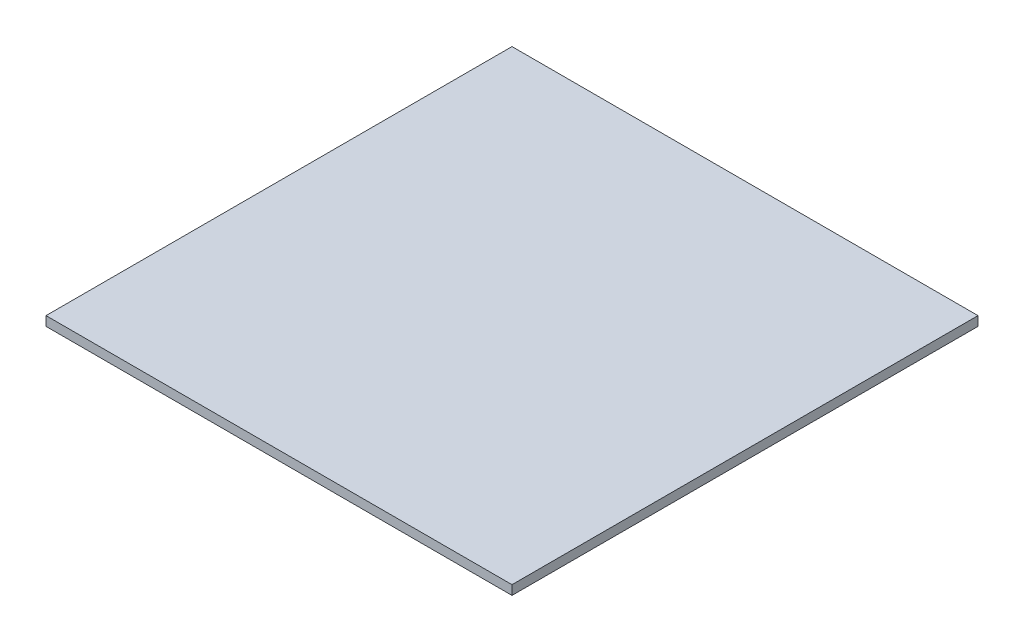
ISO-10303-21;
HEADER;
FILE_DESCRIPTION(('STEP AP214'),'2;1');
FILE_NAME('part.step','',(''),(''),'','','');
FILE_SCHEMA(('AUTOMOTIVE_DESIGN { 1 0 10303 214 1 1 1 1 }'));
ENDSEC;
DATA;
#1=APPLICATION_CONTEXT('core data for automotive mechanical design processes');
#2=APPLICATION_PROTOCOL_DEFINITION('international standard','automotive_design',2000,#1);
#3=PRODUCT_CONTEXT('',#1,'mechanical');
#4=PRODUCT('Part','Part','',(#3));
#5=PRODUCT_RELATED_PRODUCT_CATEGORY('part','',(#4));
#6=PRODUCT_DEFINITION_FORMATION('','',#4);
#7=PRODUCT_DEFINITION_CONTEXT('part definition',#1,'design');
#8=PRODUCT_DEFINITION('design','',#6,#7);
#9=PRODUCT_DEFINITION_SHAPE('','',#8);
#10=(LENGTH_UNIT() NAMED_UNIT(*) SI_UNIT(.MILLI.,.METRE.));
#11=(NAMED_UNIT(*) PLANE_ANGLE_UNIT() SI_UNIT($,.RADIAN.));
#12=(NAMED_UNIT(*) SI_UNIT($,.STERADIAN.) SOLID_ANGLE_UNIT());
#13=UNCERTAINTY_MEASURE_WITH_UNIT(LENGTH_MEASURE(1.E-05),#10,'distance_accuracy_value','');
#14=(GEOMETRIC_REPRESENTATION_CONTEXT(3) GLOBAL_UNCERTAINTY_ASSIGNED_CONTEXT((#13)) GLOBAL_UNIT_ASSIGNED_CONTEXT((#10,
#11,#12)) REPRESENTATION_CONTEXT('',''));
#15=CARTESIAN_POINT('',(0.,0.,0.));
#16=DIRECTION('',(0.,0.,1.));
#17=DIRECTION('',(1.,0.,0.));
#18=AXIS2_PLACEMENT_3D('',#15,#16,#17);
#19=CARTESIAN_POINT('',(237.6999945,-9.525,-237.6999945));
#20=DIRECTION('',(1.,0.,0.));
#21=DIRECTION('',(0.,0.,-1.));
#22=AXIS2_PLACEMENT_3D('',#19,#20,#21);
#23=PLANE('',#22);
#24=DIRECTION('',(0.,1.,0.));
#25=VECTOR('',#24,1.);
#26=CARTESIAN_POINT('',(237.6999945,-9.525,237.6999945));
#27=LINE('',#26,#25);
#28=CARTESIAN_POINT('',(237.6999945,-9.525,237.6999945));
#29=VERTEX_POINT('',#28);
#30=CARTESIAN_POINT('',(237.6999945,0.,237.6999945));
#31=VERTEX_POINT('',#30);
#32=EDGE_CURVE('E96',#29,#31,#27,.T.);
#33=ORIENTED_EDGE('',*,*,#32,.F.);
#34=DIRECTION('',(0.,0.,1.));
#35=VECTOR('',#34,1.);
#36=CARTESIAN_POINT('',(237.6999945,-9.525,-237.6999945));
#37=LINE('',#36,#35);
#38=CARTESIAN_POINT('',(237.6999945,-9.525,-237.6999945));
#39=VERTEX_POINT('',#38);
#40=EDGE_CURVE('E11',#39,#29,#37,.T.);
#41=ORIENTED_EDGE('',*,*,#40,.F.);
#42=DIRECTION('',(0.,1.,0.));
#43=VECTOR('',#42,1.);
#44=CARTESIAN_POINT('',(237.6999945,-9.525,-237.6999945));
#45=LINE('',#44,#43);
#46=CARTESIAN_POINT('',(237.6999945,0.,-237.6999945));
#47=VERTEX_POINT('',#46);
#48=EDGE_CURVE('E90',#39,#47,#45,.T.);
#49=ORIENTED_EDGE('',*,*,#48,.T.);
#50=DIRECTION('',(0.,0.,1.));
#51=VECTOR('',#50,1.);
#52=CARTESIAN_POINT('',(237.6999945,0.,-237.6999945));
#53=LINE('',#52,#51);
#54=EDGE_CURVE('E35',#47,#31,#53,.T.);
#55=ORIENTED_EDGE('',*,*,#54,.T.);
#56=EDGE_LOOP('',(#33,#41,#49,#55));
#57=FACE_BOUND('',#56,.T.);
#58=ADVANCED_FACE('F32',(#57),#23,.T.);
#59=CARTESIAN_POINT('',(-237.6999945,-9.525,-237.6999945));
#60=DIRECTION('',(0.,-1.,0.));
#61=DIRECTION('',(0.,0.,-1.));
#62=AXIS2_PLACEMENT_3D('',#59,#60,#61);
#63=PLANE('',#62);
#64=DIRECTION('',(1.,0.,0.));
#65=VECTOR('',#64,1.);
#66=CARTESIAN_POINT('',(-237.6999945,-9.525,237.6999945));
#67=LINE('',#66,#65);
#68=CARTESIAN_POINT('',(-237.6999945,-9.525,237.6999945));
#69=VERTEX_POINT('',#68);
#70=EDGE_CURVE('E92',#69,#29,#67,.T.);
#71=ORIENTED_EDGE('',*,*,#70,.F.);
#72=DIRECTION('',(0.,0.,1.));
#73=VECTOR('',#72,1.);
#74=CARTESIAN_POINT('',(-237.6999945,-9.525,-237.6999945));
#75=LINE('',#74,#73);
#76=CARTESIAN_POINT('',(-237.6999945,-9.525,-237.6999945));
#77=VERTEX_POINT('',#76);
#78=EDGE_CURVE('E41',#77,#69,#75,.T.);
#79=ORIENTED_EDGE('',*,*,#78,.F.);
#80=DIRECTION('',(1.,0.,0.));
#81=VECTOR('',#80,1.);
#82=CARTESIAN_POINT('',(-237.6999945,-9.525,-237.6999945));
#83=LINE('',#82,#81);
#84=EDGE_CURVE('E87',#77,#39,#83,.T.);
#85=ORIENTED_EDGE('',*,*,#84,.T.);
#86=ORIENTED_EDGE('',*,*,#40,.T.);
#87=EDGE_LOOP('',(#71,#79,#85,#86));
#88=FACE_BOUND('',#87,.T.);
#89=ADVANCED_FACE('F106',(#88),#63,.T.);
#90=CARTESIAN_POINT('',(-237.6999945,-9.525,-237.6999945));
#91=DIRECTION('',(-1.,0.,0.));
#92=DIRECTION('',(0.,0.,1.));
#93=AXIS2_PLACEMENT_3D('',#90,#91,#92);
#94=PLANE('',#93);
#95=DIRECTION('',(0.,-1.,0.));
#96=VECTOR('',#95,1.);
#97=CARTESIAN_POINT('',(-237.6999945,-9.525,237.6999945));
#98=LINE('',#97,#96);
#99=CARTESIAN_POINT('',(-237.6999945,0.,237.6999945));
#100=VERTEX_POINT('',#99);
#101=EDGE_CURVE('E82',#100,#69,#98,.T.);
#102=ORIENTED_EDGE('',*,*,#101,.F.);
#103=DIRECTION('',(0.,0.,1.));
#104=VECTOR('',#103,1.);
#105=CARTESIAN_POINT('',(-237.6999945,0.,-237.6999945));
#106=LINE('',#105,#104);
#107=CARTESIAN_POINT('',(-237.6999945,0.,-237.6999945));
#108=VERTEX_POINT('',#107);
#109=EDGE_CURVE('E77',#108,#100,#106,.T.);
#110=ORIENTED_EDGE('',*,*,#109,.F.);
#111=DIRECTION('',(0.,-1.,0.));
#112=VECTOR('',#111,1.);
#113=CARTESIAN_POINT('',(-237.6999945,-9.525,-237.6999945));
#114=LINE('',#113,#112);
#115=EDGE_CURVE('E80',#108,#77,#114,.T.);
#116=ORIENTED_EDGE('',*,*,#115,.T.);
#117=ORIENTED_EDGE('',*,*,#78,.T.);
#118=EDGE_LOOP('',(#102,#110,#116,#117));
#119=FACE_BOUND('',#118,.T.);
#120=ADVANCED_FACE('F79',(#119),#94,.T.);
#121=CARTESIAN_POINT('',(-237.6999945,0.,-237.6999945));
#122=DIRECTION('',(0.,1.,0.));
#123=DIRECTION('',(0.,0.,1.));
#124=AXIS2_PLACEMENT_3D('',#121,#122,#123);
#125=PLANE('',#124);
#126=DIRECTION('',(-1.,0.,0.));
#127=VECTOR('',#126,1.);
#128=CARTESIAN_POINT('',(-237.6999945,0.,237.6999945));
#129=LINE('',#128,#127);
#130=EDGE_CURVE('E99',#31,#100,#129,.T.);
#131=ORIENTED_EDGE('',*,*,#130,.F.);
#132=ORIENTED_EDGE('',*,*,#54,.F.);
#133=DIRECTION('',(-1.,0.,0.));
#134=VECTOR('',#133,1.);
#135=CARTESIAN_POINT('',(-237.6999945,0.,-237.6999945));
#136=LINE('',#135,#134);
#137=EDGE_CURVE('E86',#47,#108,#136,.T.);
#138=ORIENTED_EDGE('',*,*,#137,.T.);
#139=ORIENTED_EDGE('',*,*,#109,.T.);
#140=EDGE_LOOP('',(#131,#132,#138,#139));
#141=FACE_BOUND('',#140,.T.);
#142=ADVANCED_FACE('F89',(#141),#125,.T.);
#143=CARTESIAN_POINT('',(237.6999945,0.,-237.6999945));
#144=DIRECTION('',(0.,0.,-1.));
#145=DIRECTION('',(-1.,0.,0.));
#146=AXIS2_PLACEMENT_3D('',#143,#144,#145);
#147=PLANE('',#146);
#148=ORIENTED_EDGE('',*,*,#48,.F.);
#149=ORIENTED_EDGE('',*,*,#84,.F.);
#150=ORIENTED_EDGE('',*,*,#115,.F.);
#151=ORIENTED_EDGE('',*,*,#137,.F.);
#152=EDGE_LOOP('',(#148,#149,#150,#151));
#153=FACE_BOUND('',#152,.T.);
#154=ADVANCED_FACE('F85',(#153),#147,.T.);
#155=CARTESIAN_POINT('',(237.6999945,0.,237.6999945));
#156=DIRECTION('',(0.,0.,-1.));
#157=DIRECTION('',(-1.,0.,0.));
#158=AXIS2_PLACEMENT_3D('',#155,#156,#157);
#159=PLANE('',#158);
#160=ORIENTED_EDGE('',*,*,#32,.T.);
#161=ORIENTED_EDGE('',*,*,#130,.T.);
#162=ORIENTED_EDGE('',*,*,#101,.T.);
#163=ORIENTED_EDGE('',*,*,#70,.T.);
#164=EDGE_LOOP('',(#160,#161,#162,#163));
#165=FACE_BOUND('',#164,.T.);
#166=ADVANCED_FACE('F105',(#165),#159,.F.);
#167=CLOSED_SHELL('',(#58,#89,#120,#142,#154,#166));
#168=MANIFOLD_SOLID_BREP('B2',#167);
#169=ADVANCED_BREP_SHAPE_REPRESENTATION('',(#18,#168),#14);
#170=SHAPE_DEFINITION_REPRESENTATION(#9,#169);
ENDSEC;
END-ISO-10303-21;
